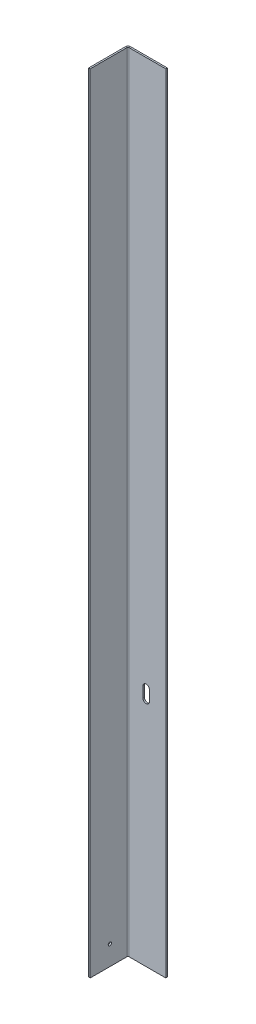
ISO-10303-21;
HEADER;
FILE_DESCRIPTION(('STEP AP214'),'2;1');
FILE_NAME('part.step','',(''),(''),'','','');
FILE_SCHEMA(('AUTOMOTIVE_DESIGN { 1 0 10303 214 1 1 1 1 }'));
ENDSEC;
DATA;
#1=APPLICATION_CONTEXT('core data for automotive mechanical design processes');
#2=APPLICATION_PROTOCOL_DEFINITION('international standard','automotive_design',2000,#1);
#3=PRODUCT_CONTEXT('',#1,'mechanical');
#4=PRODUCT('Part','Part','',(#3));
#5=PRODUCT_RELATED_PRODUCT_CATEGORY('part','',(#4));
#6=PRODUCT_DEFINITION_FORMATION('','',#4);
#7=PRODUCT_DEFINITION_CONTEXT('part definition',#1,'design');
#8=PRODUCT_DEFINITION('design','',#6,#7);
#9=PRODUCT_DEFINITION_SHAPE('','',#8);
#10=(LENGTH_UNIT() NAMED_UNIT(*) SI_UNIT(.MILLI.,.METRE.));
#11=(NAMED_UNIT(*) PLANE_ANGLE_UNIT() SI_UNIT($,.RADIAN.));
#12=(NAMED_UNIT(*) SI_UNIT($,.STERADIAN.) SOLID_ANGLE_UNIT());
#13=UNCERTAINTY_MEASURE_WITH_UNIT(LENGTH_MEASURE(1.E-05),#10,'distance_accuracy_value','');
#14=(GEOMETRIC_REPRESENTATION_CONTEXT(3) GLOBAL_UNCERTAINTY_ASSIGNED_CONTEXT((#13)) GLOBAL_UNIT_ASSIGNED_CONTEXT((#10,
#11,#12)) REPRESENTATION_CONTEXT('',''));
#15=CARTESIAN_POINT('',(0.,0.,0.));
#16=DIRECTION('',(0.,0.,1.));
#17=DIRECTION('',(1.,0.,0.));
#18=AXIS2_PLACEMENT_3D('',#15,#16,#17);
#19=CARTESIAN_POINT('',(-25.0000000000001,1000.,2.));
#20=DIRECTION('',(0.,-1.,0.));
#21=DIRECTION('',(0.,0.,-1.));
#22=AXIS2_PLACEMENT_3D('',#19,#20,#21);
#23=PLANE('',#22);
#24=DIRECTION('',(0.,0.,-1.));
#25=VECTOR('',#24,1.);
#26=CARTESIAN_POINT('',(-22.0000000000001,1000.,1.99999999999998));
#27=LINE('',#26,#25);
#28=CARTESIAN_POINT('',(-22.0000000000001,1000.,2.));
#29=VERTEX_POINT('',#28);
#30=CARTESIAN_POINT('',(-22.0000000000001,1000.,0.));
#31=VERTEX_POINT('',#30);
#32=EDGE_CURVE('E237',#29,#31,#27,.T.);
#33=ORIENTED_EDGE('',*,*,#32,.F.);
#34=DIRECTION('',(-1.,0.,0.));
#35=VECTOR('',#34,1.);
#36=CARTESIAN_POINT('',(-25.0000000000001,1000.,2.));
#37=LINE('',#36,#35);
#38=CARTESIAN_POINT('',(24.9999999999999,1000.,2.));
#39=VERTEX_POINT('',#38);
#40=EDGE_CURVE('E245',#39,#29,#37,.T.);
#41=ORIENTED_EDGE('',*,*,#40,.F.);
#42=DIRECTION('',(0.,0.,-1.));
#43=VECTOR('',#42,1.);
#44=CARTESIAN_POINT('',(24.9999999999999,1000.,2.));
#45=LINE('',#44,#43);
#46=CARTESIAN_POINT('',(24.9999999999999,1000.,0.));
#47=VERTEX_POINT('',#46);
#48=EDGE_CURVE('E13',#39,#47,#45,.T.);
#49=ORIENTED_EDGE('',*,*,#48,.T.);
#50=DIRECTION('',(-1.,0.,0.));
#51=VECTOR('',#50,1.);
#52=CARTESIAN_POINT('',(-25.0000000000001,1000.,0.));
#53=LINE('',#52,#51);
#54=EDGE_CURVE('E253',#47,#31,#53,.T.);
#55=ORIENTED_EDGE('',*,*,#54,.T.);
#56=EDGE_LOOP('',(#33,#41,#49,#55));
#57=FACE_BOUND('',#56,.T.);
#58=ADVANCED_FACE('F56',(#57),#23,.F.);
#59=CARTESIAN_POINT('',(-25.0000000000001,0.,2.));
#60=DIRECTION('',(0.,1.,0.));
#61=DIRECTION('',(0.,0.,1.));
#62=AXIS2_PLACEMENT_3D('',#59,#60,#61);
#63=PLANE('',#62);
#64=DIRECTION('',(0.,0.,-1.));
#65=VECTOR('',#64,1.);
#66=CARTESIAN_POINT('',(-22.0000000000001,0.,1.99999999999998));
#67=LINE('',#66,#65);
#68=CARTESIAN_POINT('',(-22.0000000000001,0.,2.));
#69=VERTEX_POINT('',#68);
#70=CARTESIAN_POINT('',(-22.0000000000001,0.,0.));
#71=VERTEX_POINT('',#70);
#72=EDGE_CURVE('E226',#69,#71,#67,.T.);
#73=ORIENTED_EDGE('',*,*,#72,.T.);
#74=DIRECTION('',(1.,0.,0.));
#75=VECTOR('',#74,1.);
#76=CARTESIAN_POINT('',(-25.0000000000001,0.,0.));
#77=LINE('',#76,#75);
#78=CARTESIAN_POINT('',(25.0000000000001,0.,0.));
#79=VERTEX_POINT('',#78);
#80=EDGE_CURVE('E246',#71,#79,#77,.T.);
#81=ORIENTED_EDGE('',*,*,#80,.T.);
#82=DIRECTION('',(0.,0.,-1.));
#83=VECTOR('',#82,1.);
#84=CARTESIAN_POINT('',(25.0000000000001,0.,2.));
#85=LINE('',#84,#83);
#86=CARTESIAN_POINT('',(25.0000000000001,0.,2.));
#87=VERTEX_POINT('',#86);
#88=EDGE_CURVE('E64',#87,#79,#85,.T.);
#89=ORIENTED_EDGE('',*,*,#88,.F.);
#90=DIRECTION('',(1.,0.,0.));
#91=VECTOR('',#90,1.);
#92=CARTESIAN_POINT('',(-25.0000000000001,0.,2.));
#93=LINE('',#92,#91);
#94=EDGE_CURVE('E249',#69,#87,#93,.T.);
#95=ORIENTED_EDGE('',*,*,#94,.F.);
#96=EDGE_LOOP('',(#73,#81,#89,#95));
#97=FACE_BOUND('',#96,.T.);
#98=ADVANCED_FACE('F270',(#97),#63,.F.);
#99=CARTESIAN_POINT('',(0.,0.,2.));
#100=DIRECTION('',(0.,0.,1.));
#101=DIRECTION('',(1.,0.,0.));
#102=AXIS2_PLACEMENT_3D('',#99,#100,#101);
#103=PLANE('',#102);
#104=CARTESIAN_POINT('',(0.,306.5,2.));
#105=DIRECTION('',(0.,0.,1.));
#106=DIRECTION('',(1.,0.,0.));
#107=AXIS2_PLACEMENT_3D('',#104,#105,#106);
#108=CIRCLE('',#107,4.25);
#109=CARTESIAN_POINT('',(4.25,306.5,2.));
#110=VERTEX_POINT('',#109);
#111=CARTESIAN_POINT('',(-4.25,306.5,2.));
#112=VERTEX_POINT('',#111);
#113=EDGE_CURVE('E71',#110,#112,#108,.T.);
#114=ORIENTED_EDGE('',*,*,#113,.F.);
#115=DIRECTION('',(0.,1.,0.));
#116=VECTOR('',#115,1.);
#117=CARTESIAN_POINT('',(4.25,306.5,2.));
#118=LINE('',#117,#116);
#119=CARTESIAN_POINT('',(4.24999999999999,293.5,2.));
#120=VERTEX_POINT('',#119);
#121=EDGE_CURVE('E163',#120,#110,#118,.T.);
#122=ORIENTED_EDGE('',*,*,#121,.F.);
#123=CARTESIAN_POINT('',(0.,293.5,2.));
#124=DIRECTION('',(0.,0.,1.));
#125=DIRECTION('',(1.,0.,0.));
#126=AXIS2_PLACEMENT_3D('',#123,#124,#125);
#127=CIRCLE('',#126,4.25);
#128=CARTESIAN_POINT('',(-4.25000000000001,293.5,2.));
#129=VERTEX_POINT('',#128);
#130=EDGE_CURVE('E166',#129,#120,#127,.T.);
#131=ORIENTED_EDGE('',*,*,#130,.F.);
#132=DIRECTION('',(0.,-1.,0.));
#133=VECTOR('',#132,1.);
#134=CARTESIAN_POINT('',(-4.25,306.5,2.));
#135=LINE('',#134,#133);
#136=EDGE_CURVE('E172',#112,#129,#135,.T.);
#137=ORIENTED_EDGE('',*,*,#136,.F.);
#138=EDGE_LOOP('',(#114,#122,#131,#137));
#139=FACE_BOUND('',#138,.T.);
#140=ORIENTED_EDGE('',*,*,#40,.T.);
#141=DIRECTION('',(0.,-1.,0.));
#142=VECTOR('',#141,1.);
#143=CARTESIAN_POINT('',(-22.0000000000001,0.,1.99999999999998));
#144=LINE('',#143,#142);
#145=EDGE_CURVE('E232',#69,#29,#144,.F.);
#146=ORIENTED_EDGE('',*,*,#145,.F.);
#147=ORIENTED_EDGE('',*,*,#94,.T.);
#148=DIRECTION('',(0.,1.,0.));
#149=VECTOR('',#148,1.);
#150=CARTESIAN_POINT('',(24.9999999999999,1000.,2.));
#151=LINE('',#150,#149);
#152=EDGE_CURVE('E242',#87,#39,#151,.T.);
#153=ORIENTED_EDGE('',*,*,#152,.T.);
#154=EDGE_LOOP('',(#140,#146,#147,#153));
#155=FACE_BOUND('',#154,.T.);
#156=ADVANCED_FACE('F268',(#139,#155),#103,.T.);
#157=CARTESIAN_POINT('',(0.,0.,0.));
#158=DIRECTION('',(0.,0.,1.));
#159=DIRECTION('',(1.,0.,0.));
#160=AXIS2_PLACEMENT_3D('',#157,#158,#159);
#161=PLANE('',#160);
#162=DIRECTION('',(0.,1.,0.));
#163=VECTOR('',#162,1.);
#164=CARTESIAN_POINT('',(4.25,306.5,0.));
#165=LINE('',#164,#163);
#166=CARTESIAN_POINT('',(4.24999999999999,293.5,0.));
#167=VERTEX_POINT('',#166);
#168=CARTESIAN_POINT('',(4.25,306.5,0.));
#169=VERTEX_POINT('',#168);
#170=EDGE_CURVE('E153',#167,#169,#165,.T.);
#171=ORIENTED_EDGE('',*,*,#170,.T.);
#172=CARTESIAN_POINT('',(0.,306.5,0.));
#173=DIRECTION('',(0.,0.,1.));
#174=DIRECTION('',(1.,0.,0.));
#175=AXIS2_PLACEMENT_3D('',#172,#173,#174);
#176=CIRCLE('',#175,4.25);
#177=CARTESIAN_POINT('',(-4.25,306.5,0.));
#178=VERTEX_POINT('',#177);
#179=EDGE_CURVE('E147',#169,#178,#176,.T.);
#180=ORIENTED_EDGE('',*,*,#179,.T.);
#181=DIRECTION('',(0.,-1.,0.));
#182=VECTOR('',#181,1.);
#183=CARTESIAN_POINT('',(-4.25,306.5,0.));
#184=LINE('',#183,#182);
#185=CARTESIAN_POINT('',(-4.25000000000001,293.5,0.));
#186=VERTEX_POINT('',#185);
#187=EDGE_CURVE('E156',#178,#186,#184,.T.);
#188=ORIENTED_EDGE('',*,*,#187,.T.);
#189=CARTESIAN_POINT('',(0.,293.5,0.));
#190=DIRECTION('',(0.,0.,1.));
#191=DIRECTION('',(1.,0.,0.));
#192=AXIS2_PLACEMENT_3D('',#189,#190,#191);
#193=CIRCLE('',#192,4.25);
#194=EDGE_CURVE('E79',#186,#167,#193,.T.);
#195=ORIENTED_EDGE('',*,*,#194,.T.);
#196=EDGE_LOOP('',(#171,#180,#188,#195));
#197=FACE_BOUND('',#196,.T.);
#198=DIRECTION('',(0.,-1.,0.));
#199=VECTOR('',#198,1.);
#200=CARTESIAN_POINT('',(-22.0000000000001,0.,0.));
#201=LINE('',#200,#199);
#202=EDGE_CURVE('E220',#71,#31,#201,.F.);
#203=ORIENTED_EDGE('',*,*,#202,.T.);
#204=ORIENTED_EDGE('',*,*,#54,.F.);
#205=DIRECTION('',(0.,1.,0.));
#206=VECTOR('',#205,1.);
#207=CARTESIAN_POINT('',(24.9999999999999,1000.,0.));
#208=LINE('',#207,#206);
#209=EDGE_CURVE('E240',#79,#47,#208,.T.);
#210=ORIENTED_EDGE('',*,*,#209,.F.);
#211=ORIENTED_EDGE('',*,*,#80,.F.);
#212=EDGE_LOOP('',(#203,#204,#210,#211));
#213=FACE_BOUND('',#212,.T.);
#214=ADVANCED_FACE('F160',(#197,#213),#161,.F.);
#215=CARTESIAN_POINT('',(24.9999999999999,1000.,2.));
#216=DIRECTION('',(-1.,0.,0.));
#217=DIRECTION('',(0.,-1.,0.));
#218=AXIS2_PLACEMENT_3D('',#215,#216,#217);
#219=PLANE('',#218);
#220=ORIENTED_EDGE('',*,*,#209,.T.);
#221=ORIENTED_EDGE('',*,*,#48,.F.);
#222=ORIENTED_EDGE('',*,*,#152,.F.);
#223=ORIENTED_EDGE('',*,*,#88,.T.);
#224=EDGE_LOOP('',(#220,#221,#222,#223));
#225=FACE_BOUND('',#224,.T.);
#226=ADVANCED_FACE('F58',(#225),#219,.F.);
#227=CARTESIAN_POINT('',(-22.0000000000001,1000.,2.99999999999998));
#228=DIRECTION('',(0.,1.,0.));
#229=DIRECTION('',(0.,0.,1.));
#230=AXIS2_PLACEMENT_3D('',#227,#228,#229);
#231=PLANE('',#230);
#232=DIRECTION('',(-1.,0.,0.));
#233=VECTOR('',#232,1.);
#234=CARTESIAN_POINT('',(-25.0000000000001,1000.,2.99999999999999));
#235=LINE('',#234,#233);
#236=CARTESIAN_POINT('',(-23.0000000000001,1000.,2.99999999999998));
#237=VERTEX_POINT('',#236);
#238=CARTESIAN_POINT('',(-25.0000000000001,1000.,2.99999999999997));
#239=VERTEX_POINT('',#238);
#240=EDGE_CURVE('E185',#237,#239,#235,.T.);
#241=ORIENTED_EDGE('',*,*,#240,.F.);
#242=CARTESIAN_POINT('',(-22.0000000000001,1000.,2.99999999999998));
#243=DIRECTION('',(0.,-1.,0.));
#244=DIRECTION('',(0.,0.,-1.));
#245=AXIS2_PLACEMENT_3D('',#242,#243,#244);
#246=CIRCLE('',#245,1.);
#247=EDGE_CURVE('E229',#29,#237,#246,.F.);
#248=ORIENTED_EDGE('',*,*,#247,.F.);
#249=ORIENTED_EDGE('',*,*,#32,.T.);
#250=CARTESIAN_POINT('',(-22.0000000000001,1000.,2.99999999999998));
#251=DIRECTION('',(0.,-1.,0.));
#252=DIRECTION('',(0.,0.,-1.));
#253=AXIS2_PLACEMENT_3D('',#250,#251,#252);
#254=CIRCLE('',#253,3.);
#255=EDGE_CURVE('E222',#31,#239,#254,.F.);
#256=ORIENTED_EDGE('',*,*,#255,.T.);
#257=EDGE_LOOP('',(#241,#248,#249,#256));
#258=FACE_BOUND('',#257,.T.);
#259=ADVANCED_FACE('F300',(#258),#231,.T.);
#260=CARTESIAN_POINT('',(-22.0000000000001,0.,2.99999999999998));
#261=DIRECTION('',(0.,1.,0.));
#262=DIRECTION('',(0.,0.,1.));
#263=AXIS2_PLACEMENT_3D('',#260,#261,#262);
#264=PLANE('',#263);
#265=CARTESIAN_POINT('',(-22.0000000000001,0.,2.99999999999998));
#266=DIRECTION('',(0.,-1.,0.));
#267=DIRECTION('',(0.,0.,-1.));
#268=AXIS2_PLACEMENT_3D('',#265,#266,#267);
#269=CIRCLE('',#268,1.);
#270=CARTESIAN_POINT('',(-23.0000000000001,0.,2.99999999999998));
#271=VERTEX_POINT('',#270);
#272=EDGE_CURVE('E190',#271,#69,#269,.T.);
#273=ORIENTED_EDGE('',*,*,#272,.F.);
#274=DIRECTION('',(-1.,0.,0.));
#275=VECTOR('',#274,1.);
#276=CARTESIAN_POINT('',(-23.0000000000001,0.,2.99999999999996));
#277=LINE('',#276,#275);
#278=CARTESIAN_POINT('',(-25.0000000000001,0.,2.99999999999996));
#279=VERTEX_POINT('',#278);
#280=EDGE_CURVE('E213',#271,#279,#277,.T.);
#281=ORIENTED_EDGE('',*,*,#280,.T.);
#282=CARTESIAN_POINT('',(-22.0000000000001,0.,2.99999999999998));
#283=DIRECTION('',(0.,-1.,0.));
#284=DIRECTION('',(0.,0.,-1.));
#285=AXIS2_PLACEMENT_3D('',#282,#283,#284);
#286=CIRCLE('',#285,3.);
#287=EDGE_CURVE('E223',#279,#71,#286,.T.);
#288=ORIENTED_EDGE('',*,*,#287,.T.);
#289=ORIENTED_EDGE('',*,*,#72,.F.);
#290=EDGE_LOOP('',(#273,#281,#288,#289));
#291=FACE_BOUND('',#290,.T.);
#292=ADVANCED_FACE('F273',(#291),#264,.F.);
#293=CARTESIAN_POINT('',(-22.0000000000001,0.,2.99999999999998));
#294=DIRECTION('',(0.,-1.,0.));
#295=DIRECTION('',(-1.,0.,0.));
#296=AXIS2_PLACEMENT_3D('',#293,#294,#295);
#297=CYLINDRICAL_SURFACE('',#296,3.);
#298=ORIENTED_EDGE('',*,*,#202,.F.);
#299=ORIENTED_EDGE('',*,*,#287,.F.);
#300=DIRECTION('',(0.,-1.,0.));
#301=VECTOR('',#300,1.);
#302=CARTESIAN_POINT('',(-25.0000000000001,0.,2.99999999999996));
#303=LINE('',#302,#301);
#304=EDGE_CURVE('E210',#239,#279,#303,.T.);
#305=ORIENTED_EDGE('',*,*,#304,.F.);
#306=ORIENTED_EDGE('',*,*,#255,.F.);
#307=EDGE_LOOP('',(#298,#299,#305,#306));
#308=FACE_BOUND('',#307,.T.);
#309=ADVANCED_FACE('F298',(#308),#297,.T.);
#310=CARTESIAN_POINT('',(-22.0000000000001,0.,2.99999999999998));
#311=DIRECTION('',(0.,-1.,0.));
#312=DIRECTION('',(-1.,0.,0.));
#313=AXIS2_PLACEMENT_3D('',#310,#311,#312);
#314=CYLINDRICAL_SURFACE('',#313,1.);
#315=ORIENTED_EDGE('',*,*,#145,.T.);
#316=ORIENTED_EDGE('',*,*,#247,.T.);
#317=DIRECTION('',(0.,1.,0.));
#318=VECTOR('',#317,1.);
#319=CARTESIAN_POINT('',(-23.0000000000001,1000.,3.));
#320=LINE('',#319,#318);
#321=EDGE_CURVE('E216',#237,#271,#320,.F.);
#322=ORIENTED_EDGE('',*,*,#321,.T.);
#323=ORIENTED_EDGE('',*,*,#272,.T.);
#324=EDGE_LOOP('',(#315,#316,#322,#323));
#325=FACE_BOUND('',#324,.T.);
#326=ADVANCED_FACE('F275',(#325),#314,.F.);
#327=CARTESIAN_POINT('',(-25.0000000000001,0.,1.99999999999999));
#328=DIRECTION('',(0.,-1.,0.));
#329=DIRECTION('',(0.,0.,-1.));
#330=AXIS2_PLACEMENT_3D('',#327,#328,#329);
#331=PLANE('',#330);
#332=DIRECTION('',(0.,0.,-1.));
#333=VECTOR('',#332,1.);
#334=CARTESIAN_POINT('',(-25.0000000000001,0.,1.99999999999999));
#335=LINE('',#334,#333);
#336=CARTESIAN_POINT('',(-25.0000000000002,0.,50.));
#337=VERTEX_POINT('',#336);
#338=EDGE_CURVE('E194',#337,#279,#335,.T.);
#339=ORIENTED_EDGE('',*,*,#338,.T.);
#340=ORIENTED_EDGE('',*,*,#280,.F.);
#341=DIRECTION('',(0.,0.,1.));
#342=VECTOR('',#341,1.);
#343=CARTESIAN_POINT('',(-23.0000000000001,0.,0.));
#344=LINE('',#343,#342);
#345=CARTESIAN_POINT('',(-23.0000000000002,0.,50.));
#346=VERTEX_POINT('',#345);
#347=EDGE_CURVE('E202',#346,#271,#344,.F.);
#348=ORIENTED_EDGE('',*,*,#347,.F.);
#349=DIRECTION('',(1.,0.,0.));
#350=VECTOR('',#349,1.);
#351=CARTESIAN_POINT('',(-25.0000000000002,0.,50.));
#352=LINE('',#351,#350);
#353=EDGE_CURVE('E188',#337,#346,#352,.T.);
#354=ORIENTED_EDGE('',*,*,#353,.F.);
#355=EDGE_LOOP('',(#339,#340,#348,#354));
#356=FACE_BOUND('',#355,.T.);
#357=ADVANCED_FACE('F292',(#356),#331,.T.);
#358=CARTESIAN_POINT('',(-25.0000000000002,1000.,50.));
#359=DIRECTION('',(0.,1.,0.));
#360=DIRECTION('',(0.,0.,1.));
#361=AXIS2_PLACEMENT_3D('',#358,#359,#360);
#362=PLANE('',#361);
#363=DIRECTION('',(0.,0.,-1.));
#364=VECTOR('',#363,1.);
#365=CARTESIAN_POINT('',(-23.0000000000001,1000.,-2.39970080843458E-12));
#366=LINE('',#365,#364);
#367=CARTESIAN_POINT('',(-23.0000000000002,1000.,50.));
#368=VERTEX_POINT('',#367);
#369=EDGE_CURVE('E208',#237,#368,#366,.F.);
#370=ORIENTED_EDGE('',*,*,#369,.F.);
#371=ORIENTED_EDGE('',*,*,#240,.T.);
#372=DIRECTION('',(0.,0.,1.));
#373=VECTOR('',#372,1.);
#374=CARTESIAN_POINT('',(-25.0000000000002,1000.,50.));
#375=LINE('',#374,#373);
#376=CARTESIAN_POINT('',(-25.0000000000002,1000.,50.));
#377=VERTEX_POINT('',#376);
#378=EDGE_CURVE('E200',#239,#377,#375,.T.);
#379=ORIENTED_EDGE('',*,*,#378,.T.);
#380=DIRECTION('',(1.,0.,0.));
#381=VECTOR('',#380,1.);
#382=CARTESIAN_POINT('',(-25.0000000000002,1000.,50.));
#383=LINE('',#382,#381);
#384=EDGE_CURVE('E191',#377,#368,#383,.T.);
#385=ORIENTED_EDGE('',*,*,#384,.T.);
#386=EDGE_LOOP('',(#370,#371,#379,#385));
#387=FACE_BOUND('',#386,.T.);
#388=ADVANCED_FACE('F284',(#387),#362,.T.);
#389=CARTESIAN_POINT('',(-25.,0.,0.));
#390=DIRECTION('',(-1.,0.,0.));
#391=DIRECTION('',(0.,0.,1.));
#392=AXIS2_PLACEMENT_3D('',#389,#390,#391);
#393=PLANE('',#392);
#394=CARTESIAN_POINT('',(-25.0000000000001,25.,25.));
#395=DIRECTION('',(1.,0.,0.));
#396=DIRECTION('',(0.,0.,-1.));
#397=AXIS2_PLACEMENT_3D('',#394,#395,#396);
#398=CIRCLE('',#397,2.09999999999999);
#399=CARTESIAN_POINT('',(-25.0000000000001,25.,22.9));
#400=VERTEX_POINT('',#399);
#401=EDGE_CURVE('E182',#400,#400,#398,.T.);
#402=ORIENTED_EDGE('',*,*,#401,.T.);
#403=EDGE_LOOP('',(#402));
#404=FACE_BOUND('',#403,.T.);
#405=ORIENTED_EDGE('',*,*,#378,.F.);
#406=ORIENTED_EDGE('',*,*,#304,.T.);
#407=ORIENTED_EDGE('',*,*,#338,.F.);
#408=DIRECTION('',(0.,-1.,0.));
#409=VECTOR('',#408,1.);
#410=CARTESIAN_POINT('',(-25.0000000000002,0.,50.));
#411=LINE('',#410,#409);
#412=EDGE_CURVE('E197',#377,#337,#411,.T.);
#413=ORIENTED_EDGE('',*,*,#412,.F.);
#414=EDGE_LOOP('',(#405,#406,#407,#413));
#415=FACE_BOUND('',#414,.T.);
#416=ADVANCED_FACE('F295',(#404,#415),#393,.T.);
#417=CARTESIAN_POINT('',(-23.0000000000001,0.,0.));
#418=DIRECTION('',(-1.,0.,0.));
#419=DIRECTION('',(0.,0.,1.));
#420=AXIS2_PLACEMENT_3D('',#417,#418,#419);
#421=PLANE('',#420);
#422=CARTESIAN_POINT('',(-23.0000000000001,25.,25.));
#423=DIRECTION('',(1.,0.,0.));
#424=DIRECTION('',(0.,0.,-1.));
#425=AXIS2_PLACEMENT_3D('',#422,#423,#424);
#426=CIRCLE('',#425,2.09999999999999);
#427=CARTESIAN_POINT('',(-23.0000000000001,25.,22.9));
#428=VERTEX_POINT('',#427);
#429=EDGE_CURVE('E178',#428,#428,#426,.T.);
#430=ORIENTED_EDGE('',*,*,#429,.F.);
#431=EDGE_LOOP('',(#430));
#432=FACE_BOUND('',#431,.T.);
#433=ORIENTED_EDGE('',*,*,#321,.F.);
#434=ORIENTED_EDGE('',*,*,#369,.T.);
#435=DIRECTION('',(0.,1.,0.));
#436=VECTOR('',#435,1.);
#437=CARTESIAN_POINT('',(-23.0000000000002,0.,50.));
#438=LINE('',#437,#436);
#439=EDGE_CURVE('E205',#368,#346,#438,.F.);
#440=ORIENTED_EDGE('',*,*,#439,.T.);
#441=ORIENTED_EDGE('',*,*,#347,.T.);
#442=EDGE_LOOP('',(#433,#434,#440,#441));
#443=FACE_BOUND('',#442,.T.);
#444=ADVANCED_FACE('F280',(#432,#443),#421,.F.);
#445=CARTESIAN_POINT('',(-25.0000000000002,0.,50.));
#446=DIRECTION('',(0.,0.,1.));
#447=DIRECTION('',(1.,0.,0.));
#448=AXIS2_PLACEMENT_3D('',#445,#446,#447);
#449=PLANE('',#448);
#450=ORIENTED_EDGE('',*,*,#439,.F.);
#451=ORIENTED_EDGE('',*,*,#384,.F.);
#452=ORIENTED_EDGE('',*,*,#412,.T.);
#453=ORIENTED_EDGE('',*,*,#353,.T.);
#454=EDGE_LOOP('',(#450,#451,#452,#453));
#455=FACE_BOUND('',#454,.T.);
#456=ADVANCED_FACE('F290',(#455),#449,.T.);
#457=CARTESIAN_POINT('',(-25.0000000000001,25.,25.));
#458=DIRECTION('',(1.,0.,0.));
#459=DIRECTION('',(0.,0.,-1.));
#460=AXIS2_PLACEMENT_3D('',#457,#458,#459);
#461=CYLINDRICAL_SURFACE('',#460,2.09999999999999);
#462=ORIENTED_EDGE('',*,*,#401,.F.);
#463=EDGE_LOOP('',(#462));
#464=FACE_BOUND('',#463,.T.);
#465=ORIENTED_EDGE('',*,*,#429,.T.);
#466=EDGE_LOOP('',(#465));
#467=FACE_BOUND('',#466,.T.);
#468=ADVANCED_FACE('F333',(#464,#467),#461,.F.);
#469=CARTESIAN_POINT('',(0.,306.5,0.));
#470=DIRECTION('',(0.,0.,1.));
#471=DIRECTION('',(1.,0.,0.));
#472=AXIS2_PLACEMENT_3D('',#469,#470,#471);
#473=CYLINDRICAL_SURFACE('',#472,4.25);
#474=ORIENTED_EDGE('',*,*,#113,.T.);
#475=DIRECTION('',(0.,0.,1.));
#476=VECTOR('',#475,1.);
#477=CARTESIAN_POINT('',(-4.25,306.5,0.));
#478=LINE('',#477,#476);
#479=EDGE_CURVE('E143',#178,#112,#478,.T.);
#480=ORIENTED_EDGE('',*,*,#479,.F.);
#481=ORIENTED_EDGE('',*,*,#179,.F.);
#482=DIRECTION('',(0.,0.,1.));
#483=VECTOR('',#482,1.);
#484=CARTESIAN_POINT('',(4.25,306.5,0.));
#485=LINE('',#484,#483);
#486=EDGE_CURVE('E176',#169,#110,#485,.T.);
#487=ORIENTED_EDGE('',*,*,#486,.T.);
#488=EDGE_LOOP('',(#474,#480,#481,#487));
#489=FACE_BOUND('',#488,.T.);
#490=ADVANCED_FACE('F145',(#489),#473,.F.);
#491=CARTESIAN_POINT('',(4.25,306.5,0.));
#492=DIRECTION('',(1.,0.,0.));
#493=DIRECTION('',(0.,1.,0.));
#494=AXIS2_PLACEMENT_3D('',#491,#492,#493);
#495=PLANE('',#494);
#496=ORIENTED_EDGE('',*,*,#121,.T.);
#497=ORIENTED_EDGE('',*,*,#486,.F.);
#498=ORIENTED_EDGE('',*,*,#170,.F.);
#499=DIRECTION('',(0.,0.,1.));
#500=VECTOR('',#499,1.);
#501=CARTESIAN_POINT('',(4.24999999999999,293.5,0.));
#502=LINE('',#501,#500);
#503=EDGE_CURVE('E179',#167,#120,#502,.T.);
#504=ORIENTED_EDGE('',*,*,#503,.T.);
#505=EDGE_LOOP('',(#496,#497,#498,#504));
#506=FACE_BOUND('',#505,.T.);
#507=ADVANCED_FACE('F325',(#506),#495,.F.);
#508=CARTESIAN_POINT('',(0.,293.5,0.));
#509=DIRECTION('',(0.,0.,1.));
#510=DIRECTION('',(1.,0.,0.));
#511=AXIS2_PLACEMENT_3D('',#508,#509,#510);
#512=CYLINDRICAL_SURFACE('',#511,4.25);
#513=ORIENTED_EDGE('',*,*,#130,.T.);
#514=ORIENTED_EDGE('',*,*,#503,.F.);
#515=ORIENTED_EDGE('',*,*,#194,.F.);
#516=DIRECTION('',(0.,0.,1.));
#517=VECTOR('',#516,1.);
#518=CARTESIAN_POINT('',(-4.25000000000001,293.5,0.));
#519=LINE('',#518,#517);
#520=EDGE_CURVE('E152',#186,#129,#519,.T.);
#521=ORIENTED_EDGE('',*,*,#520,.T.);
#522=EDGE_LOOP('',(#513,#514,#515,#521));
#523=FACE_BOUND('',#522,.T.);
#524=ADVANCED_FACE('F323',(#523),#512,.F.);
#525=CARTESIAN_POINT('',(-4.25,306.5,0.));
#526=DIRECTION('',(-1.,0.,0.));
#527=DIRECTION('',(0.,-1.,0.));
#528=AXIS2_PLACEMENT_3D('',#525,#526,#527);
#529=PLANE('',#528);
#530=ORIENTED_EDGE('',*,*,#136,.T.);
#531=ORIENTED_EDGE('',*,*,#520,.F.);
#532=ORIENTED_EDGE('',*,*,#187,.F.);
#533=ORIENTED_EDGE('',*,*,#479,.T.);
#534=EDGE_LOOP('',(#530,#531,#532,#533));
#535=FACE_BOUND('',#534,.T.);
#536=ADVANCED_FACE('F157',(#535),#529,.F.);
#537=CLOSED_SHELL('',(#58,#98,#156,#214,#226,#259,#292,#309,#326,#357,#388,#416,#444,#456,#468,
#490,#507,#524,#536));
#538=MANIFOLD_SOLID_BREP('B2',#537);
#539=ADVANCED_BREP_SHAPE_REPRESENTATION('',(#18,#538),#14);
#540=SHAPE_DEFINITION_REPRESENTATION(#9,#539);
ENDSEC;
END-ISO-10303-21;
